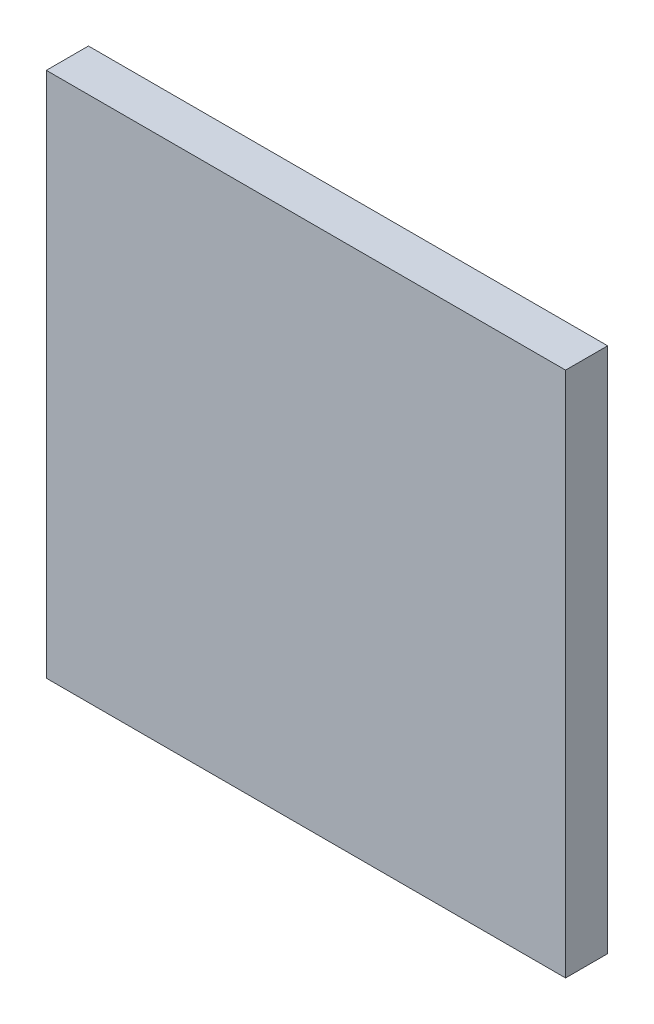
ISO-10303-21;
HEADER;
FILE_DESCRIPTION(('STEP AP214'),'2;1');
FILE_NAME('part.step','',(''),(''),'','','');
FILE_SCHEMA(('AUTOMOTIVE_DESIGN { 1 0 10303 214 1 1 1 1 }'));
ENDSEC;
DATA;
#1=APPLICATION_CONTEXT('core data for automotive mechanical design processes');
#2=APPLICATION_PROTOCOL_DEFINITION('international standard','automotive_design',2000,#1);
#3=PRODUCT_CONTEXT('',#1,'mechanical');
#4=PRODUCT('Part','Part','',(#3));
#5=PRODUCT_RELATED_PRODUCT_CATEGORY('part','',(#4));
#6=PRODUCT_DEFINITION_FORMATION('','',#4);
#7=PRODUCT_DEFINITION_CONTEXT('part definition',#1,'design');
#8=PRODUCT_DEFINITION('design','',#6,#7);
#9=PRODUCT_DEFINITION_SHAPE('','',#8);
#10=(LENGTH_UNIT() NAMED_UNIT(*) SI_UNIT(.MILLI.,.METRE.));
#11=(NAMED_UNIT(*) PLANE_ANGLE_UNIT() SI_UNIT($,.RADIAN.));
#12=(NAMED_UNIT(*) SI_UNIT($,.STERADIAN.) SOLID_ANGLE_UNIT());
#13=UNCERTAINTY_MEASURE_WITH_UNIT(LENGTH_MEASURE(1.E-05),#10,'distance_accuracy_value','');
#14=(GEOMETRIC_REPRESENTATION_CONTEXT(3) GLOBAL_UNCERTAINTY_ASSIGNED_CONTEXT((#13)) GLOBAL_UNIT_ASSIGNED_CONTEXT((#10,
#11,#12)) REPRESENTATION_CONTEXT('',''));
#15=CARTESIAN_POINT('',(0.,0.,0.));
#16=DIRECTION('',(0.,0.,1.));
#17=DIRECTION('',(1.,0.,0.));
#18=AXIS2_PLACEMENT_3D('',#15,#16,#17);
#19=CARTESIAN_POINT('',(0.,0.,10.));
#20=DIRECTION('',(1.,0.,0.));
#21=DIRECTION('',(0.,0.,-1.));
#22=AXIS2_PLACEMENT_3D('',#19,#20,#21);
#23=PLANE('',#22);
#24=DIRECTION('',(0.,-1.,0.));
#25=VECTOR('',#24,1.);
#26=CARTESIAN_POINT('',(0.,0.,0.));
#27=LINE('',#26,#25);
#28=CARTESIAN_POINT('',(0.,125.,0.));
#29=VERTEX_POINT('',#28);
#30=CARTESIAN_POINT('',(0.,0.,0.));
#31=VERTEX_POINT('',#30);
#32=EDGE_CURVE('E100',#29,#31,#27,.T.);
#33=ORIENTED_EDGE('',*,*,#32,.T.);
#34=DIRECTION('',(0.,0.,-1.));
#35=VECTOR('',#34,1.);
#36=CARTESIAN_POINT('',(0.,0.,10.));
#37=LINE('',#36,#35);
#38=CARTESIAN_POINT('',(0.,0.,10.));
#39=VERTEX_POINT('',#38);
#40=EDGE_CURVE('E11',#39,#31,#37,.T.);
#41=ORIENTED_EDGE('',*,*,#40,.F.);
#42=DIRECTION('',(0.,-1.,0.));
#43=VECTOR('',#42,1.);
#44=CARTESIAN_POINT('',(0.,0.,10.));
#45=LINE('',#44,#43);
#46=CARTESIAN_POINT('',(0.,125.,10.));
#47=VERTEX_POINT('',#46);
#48=EDGE_CURVE('E88',#47,#39,#45,.T.);
#49=ORIENTED_EDGE('',*,*,#48,.F.);
#50=DIRECTION('',(0.,0.,-1.));
#51=VECTOR('',#50,1.);
#52=CARTESIAN_POINT('',(0.,125.,10.));
#53=LINE('',#52,#51);
#54=EDGE_CURVE('E96',#47,#29,#53,.T.);
#55=ORIENTED_EDGE('',*,*,#54,.T.);
#56=EDGE_LOOP('',(#33,#41,#49,#55));
#57=FACE_BOUND('',#56,.T.);
#58=ADVANCED_FACE('F37',(#57),#23,.F.);
#59=CARTESIAN_POINT('',(0.,0.,10.));
#60=DIRECTION('',(0.,1.,0.));
#61=DIRECTION('',(0.,0.,1.));
#62=AXIS2_PLACEMENT_3D('',#59,#60,#61);
#63=PLANE('',#62);
#64=DIRECTION('',(1.,0.,0.));
#65=VECTOR('',#64,1.);
#66=CARTESIAN_POINT('',(0.,0.,0.));
#67=LINE('',#66,#65);
#68=CARTESIAN_POINT('',(123.29,0.,0.));
#69=VERTEX_POINT('',#68);
#70=EDGE_CURVE('E92',#31,#69,#67,.T.);
#71=ORIENTED_EDGE('',*,*,#70,.T.);
#72=DIRECTION('',(0.,0.,-1.));
#73=VECTOR('',#72,1.);
#74=CARTESIAN_POINT('',(123.29,0.,10.));
#75=LINE('',#74,#73);
#76=CARTESIAN_POINT('',(123.29,0.,10.));
#77=VERTEX_POINT('',#76);
#78=EDGE_CURVE('E45',#77,#69,#75,.T.);
#79=ORIENTED_EDGE('',*,*,#78,.F.);
#80=DIRECTION('',(1.,0.,0.));
#81=VECTOR('',#80,1.);
#82=CARTESIAN_POINT('',(0.,0.,10.));
#83=LINE('',#82,#81);
#84=EDGE_CURVE('E83',#39,#77,#83,.T.);
#85=ORIENTED_EDGE('',*,*,#84,.F.);
#86=ORIENTED_EDGE('',*,*,#40,.T.);
#87=EDGE_LOOP('',(#71,#79,#85,#86));
#88=FACE_BOUND('',#87,.T.);
#89=ADVANCED_FACE('F91',(#88),#63,.F.);
#90=CARTESIAN_POINT('',(123.29,0.,10.));
#91=DIRECTION('',(-1.,0.,0.));
#92=DIRECTION('',(0.,0.,1.));
#93=AXIS2_PLACEMENT_3D('',#90,#91,#92);
#94=PLANE('',#93);
#95=DIRECTION('',(0.,1.,0.));
#96=VECTOR('',#95,1.);
#97=CARTESIAN_POINT('',(123.29,0.,0.));
#98=LINE('',#97,#96);
#99=CARTESIAN_POINT('',(123.29,125.,0.));
#100=VERTEX_POINT('',#99);
#101=EDGE_CURVE('E70',#69,#100,#98,.T.);
#102=ORIENTED_EDGE('',*,*,#101,.T.);
#103=DIRECTION('',(0.,0.,-1.));
#104=VECTOR('',#103,1.);
#105=CARTESIAN_POINT('',(123.29,125.,10.));
#106=LINE('',#105,#104);
#107=CARTESIAN_POINT('',(123.29,125.,10.));
#108=VERTEX_POINT('',#107);
#109=EDGE_CURVE('E93',#108,#100,#106,.T.);
#110=ORIENTED_EDGE('',*,*,#109,.F.);
#111=DIRECTION('',(0.,1.,0.));
#112=VECTOR('',#111,1.);
#113=CARTESIAN_POINT('',(123.29,0.,10.));
#114=LINE('',#113,#112);
#115=EDGE_CURVE('E86',#77,#108,#114,.T.);
#116=ORIENTED_EDGE('',*,*,#115,.F.);
#117=ORIENTED_EDGE('',*,*,#78,.T.);
#118=EDGE_LOOP('',(#102,#110,#116,#117));
#119=FACE_BOUND('',#118,.T.);
#120=ADVANCED_FACE('F94',(#119),#94,.F.);
#121=CARTESIAN_POINT('',(123.29,125.,10.));
#122=DIRECTION('',(0.,-1.,0.));
#123=DIRECTION('',(1.,0.,0.));
#124=AXIS2_PLACEMENT_3D('',#121,#122,#123);
#125=PLANE('',#124);
#126=DIRECTION('',(-1.,0.,0.));
#127=VECTOR('',#126,1.);
#128=CARTESIAN_POINT('',(123.29,125.,0.));
#129=LINE('',#128,#127);
#130=EDGE_CURVE('E76',#100,#29,#129,.T.);
#131=ORIENTED_EDGE('',*,*,#130,.T.);
#132=ORIENTED_EDGE('',*,*,#54,.F.);
#133=DIRECTION('',(-1.,0.,0.));
#134=VECTOR('',#133,1.);
#135=CARTESIAN_POINT('',(123.29,125.,10.));
#136=LINE('',#135,#134);
#137=EDGE_CURVE('E53',#108,#47,#136,.T.);
#138=ORIENTED_EDGE('',*,*,#137,.F.);
#139=ORIENTED_EDGE('',*,*,#109,.T.);
#140=EDGE_LOOP('',(#131,#132,#138,#139));
#141=FACE_BOUND('',#140,.T.);
#142=ADVANCED_FACE('F107',(#141),#125,.F.);
#143=CARTESIAN_POINT('',(0.,0.,10.));
#144=DIRECTION('',(0.,0.,1.));
#145=DIRECTION('',(1.,0.,0.));
#146=AXIS2_PLACEMENT_3D('',#143,#144,#145);
#147=PLANE('',#146);
#148=ORIENTED_EDGE('',*,*,#48,.T.);
#149=ORIENTED_EDGE('',*,*,#84,.T.);
#150=ORIENTED_EDGE('',*,*,#115,.T.);
#151=ORIENTED_EDGE('',*,*,#137,.T.);
#152=EDGE_LOOP('',(#148,#149,#150,#151));
#153=FACE_BOUND('',#152,.T.);
#154=ADVANCED_FACE('F84',(#153),#147,.T.);
#155=CARTESIAN_POINT('',(0.,0.,0.));
#156=DIRECTION('',(0.,0.,1.));
#157=DIRECTION('',(1.,0.,0.));
#158=AXIS2_PLACEMENT_3D('',#155,#156,#157);
#159=PLANE('',#158);
#160=ORIENTED_EDGE('',*,*,#32,.F.);
#161=ORIENTED_EDGE('',*,*,#130,.F.);
#162=ORIENTED_EDGE('',*,*,#101,.F.);
#163=ORIENTED_EDGE('',*,*,#70,.F.);
#164=EDGE_LOOP('',(#160,#161,#162,#163));
#165=FACE_BOUND('',#164,.T.);
#166=ADVANCED_FACE('F110',(#165),#159,.F.);
#167=CLOSED_SHELL('',(#58,#89,#120,#142,#154,#166));
#168=MANIFOLD_SOLID_BREP('B2',#167);
#169=ADVANCED_BREP_SHAPE_REPRESENTATION('',(#18,#168),#14);
#170=SHAPE_DEFINITION_REPRESENTATION(#9,#169);
ENDSEC;
END-ISO-10303-21;
